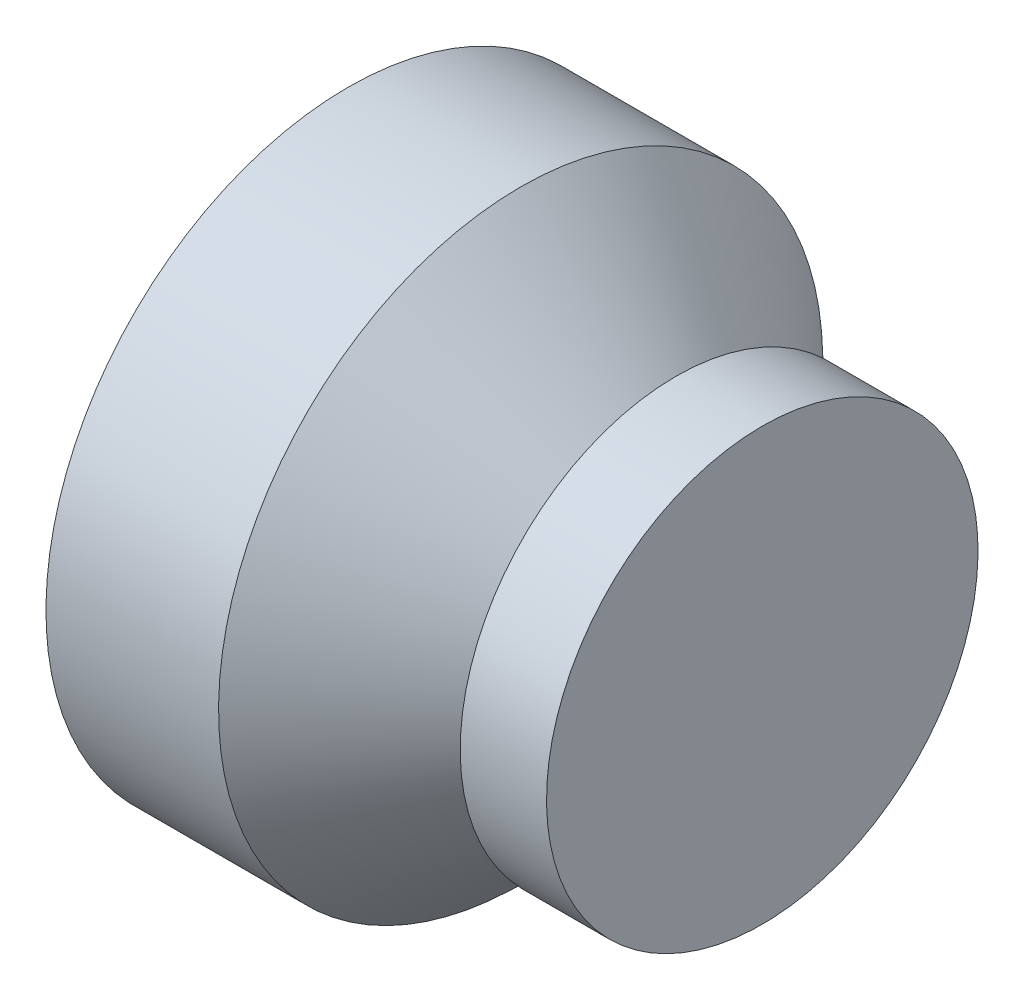
ISO-10303-21;
HEADER;
FILE_DESCRIPTION(('STEP AP214'),'2;1');
FILE_NAME('part.step','',(''),(''),'','','');
FILE_SCHEMA(('AUTOMOTIVE_DESIGN { 1 0 10303 214 1 1 1 1 }'));
ENDSEC;
DATA;
#1=APPLICATION_CONTEXT('core data for automotive mechanical design processes');
#2=APPLICATION_PROTOCOL_DEFINITION('international standard','automotive_design',2000,#1);
#3=PRODUCT_CONTEXT('',#1,'mechanical');
#4=PRODUCT('Part','Part','',(#3));
#5=PRODUCT_RELATED_PRODUCT_CATEGORY('part','',(#4));
#6=PRODUCT_DEFINITION_FORMATION('','',#4);
#7=PRODUCT_DEFINITION_CONTEXT('part definition',#1,'design');
#8=PRODUCT_DEFINITION('design','',#6,#7);
#9=PRODUCT_DEFINITION_SHAPE('','',#8);
#10=(LENGTH_UNIT() NAMED_UNIT(*) SI_UNIT(.MILLI.,.METRE.));
#11=(NAMED_UNIT(*) PLANE_ANGLE_UNIT() SI_UNIT($,.RADIAN.));
#12=(NAMED_UNIT(*) SI_UNIT($,.STERADIAN.) SOLID_ANGLE_UNIT());
#13=UNCERTAINTY_MEASURE_WITH_UNIT(LENGTH_MEASURE(1.E-05),#10,'distance_accuracy_value','');
#14=(GEOMETRIC_REPRESENTATION_CONTEXT(3) GLOBAL_UNCERTAINTY_ASSIGNED_CONTEXT((#13)) GLOBAL_UNIT_ASSIGNED_CONTEXT((#10,
#11,#12)) REPRESENTATION_CONTEXT('',''));
#15=CARTESIAN_POINT('',(0.,0.,0.));
#16=DIRECTION('',(0.,0.,1.));
#17=DIRECTION('',(1.,0.,0.));
#18=AXIS2_PLACEMENT_3D('',#15,#16,#17);
#19=CARTESIAN_POINT('',(-119.,12.5,0.));
#20=DIRECTION('',(-1.,0.,0.));
#21=DIRECTION('',(0.,-1.,0.));
#22=AXIS2_PLACEMENT_3D('',#19,#20,#21);
#23=PLANE('',#22);
#24=CARTESIAN_POINT('',(-119.,0.,0.));
#25=DIRECTION('',(1.,0.,0.));
#26=DIRECTION('',(0.,1.,0.));
#27=AXIS2_PLACEMENT_3D('',#24,#25,#26);
#28=CIRCLE('',#27,12.5);
#29=CARTESIAN_POINT('',(-119.,12.5,0.));
#30=VERTEX_POINT('',#29);
#31=EDGE_CURVE('E53',#30,#30,#28,.T.);
#32=ORIENTED_EDGE('',*,*,#31,.T.);
#33=EDGE_LOOP('',(#32));
#34=FACE_BOUND('',#33,.T.);
#35=ADVANCED_FACE('F34',(#34),#23,.F.);
#36=CARTESIAN_POINT('',(-143.,17.5,0.));
#37=DIRECTION('',(-1.,0.,0.));
#38=DIRECTION('',(0.,-1.,0.));
#39=AXIS2_PLACEMENT_3D('',#36,#37,#38);
#40=PLANE('',#39);
#41=CARTESIAN_POINT('',(-143.,0.,0.));
#42=DIRECTION('',(1.,0.,0.));
#43=DIRECTION('',(0.,1.,0.));
#44=AXIS2_PLACEMENT_3D('',#41,#42,#43);
#45=CIRCLE('',#44,17.5);
#46=CARTESIAN_POINT('',(-143.,17.5,0.));
#47=VERTEX_POINT('',#46);
#48=EDGE_CURVE('E10',#47,#47,#45,.T.);
#49=ORIENTED_EDGE('',*,*,#48,.F.);
#50=EDGE_LOOP('',(#49));
#51=FACE_BOUND('',#50,.T.);
#52=ADVANCED_FACE('F70',(#51),#40,.T.);
#53=CARTESIAN_POINT('',(-119.,0.,0.));
#54=DIRECTION('',(1.,0.,0.));
#55=DIRECTION('',(0.,1.,0.));
#56=AXIS2_PLACEMENT_3D('',#53,#54,#55);
#57=CYLINDRICAL_SURFACE('',#56,17.5);
#58=ORIENTED_EDGE('',*,*,#48,.T.);
#59=EDGE_LOOP('',(#58));
#60=FACE_BOUND('',#59,.T.);
#61=CARTESIAN_POINT('',(-133.,0.,0.));
#62=DIRECTION('',(1.,0.,0.));
#63=DIRECTION('',(0.,1.,0.));
#64=AXIS2_PLACEMENT_3D('',#61,#62,#63);
#65=CIRCLE('',#64,17.5);
#66=CARTESIAN_POINT('',(-133.,17.5,0.));
#67=VERTEX_POINT('',#66);
#68=EDGE_CURVE('E40',#67,#67,#65,.T.);
#69=ORIENTED_EDGE('',*,*,#68,.F.);
#70=EDGE_LOOP('',(#69));
#71=FACE_BOUND('',#70,.T.);
#72=ADVANCED_FACE('F74',(#60,#71),#57,.T.);
#73=CARTESIAN_POINT('',(-124.,0.,0.));
#74=DIRECTION('',(-1.,0.,0.));
#75=DIRECTION('',(0.,-1.,0.));
#76=AXIS2_PLACEMENT_3D('',#73,#74,#75);
#77=CONICAL_SURFACE('',#76,8.99999999999998,0.756834505558693);
#78=ORIENTED_EDGE('',*,*,#68,.T.);
#79=EDGE_LOOP('',(#78));
#80=FACE_BOUND('',#79,.T.);
#81=CARTESIAN_POINT('',(-124.,0.,0.));
#82=DIRECTION('',(1.,0.,0.));
#83=DIRECTION('',(0.,1.,0.));
#84=AXIS2_PLACEMENT_3D('',#81,#82,#83);
#85=CIRCLE('',#84,8.99999999999998);
#86=CARTESIAN_POINT('',(-124.,9.,0.));
#87=VERTEX_POINT('',#86);
#88=EDGE_CURVE('E44',#87,#87,#85,.T.);
#89=ORIENTED_EDGE('',*,*,#88,.F.);
#90=EDGE_LOOP('',(#89));
#91=FACE_BOUND('',#90,.T.);
#92=ADVANCED_FACE('F66',(#80,#91),#77,.T.);
#93=CARTESIAN_POINT('',(-124.,12.5,0.));
#94=DIRECTION('',(-1.,0.,0.));
#95=DIRECTION('',(0.,-1.,0.));
#96=AXIS2_PLACEMENT_3D('',#93,#94,#95);
#97=PLANE('',#96);
#98=ORIENTED_EDGE('',*,*,#88,.T.);
#99=EDGE_LOOP('',(#98));
#100=FACE_BOUND('',#99,.T.);
#101=CARTESIAN_POINT('',(-124.,0.,0.));
#102=DIRECTION('',(1.,0.,0.));
#103=DIRECTION('',(0.,1.,0.));
#104=AXIS2_PLACEMENT_3D('',#101,#102,#103);
#105=CIRCLE('',#104,12.5);
#106=CARTESIAN_POINT('',(-124.,12.5,0.));
#107=VERTEX_POINT('',#106);
#108=EDGE_CURVE('E48',#107,#107,#105,.T.);
#109=ORIENTED_EDGE('',*,*,#108,.F.);
#110=EDGE_LOOP('',(#109));
#111=FACE_BOUND('',#110,.T.);
#112=ADVANCED_FACE('F60',(#100,#111),#97,.T.);
#113=CARTESIAN_POINT('',(-119.,0.,0.));
#114=DIRECTION('',(1.,0.,0.));
#115=DIRECTION('',(0.,1.,0.));
#116=AXIS2_PLACEMENT_3D('',#113,#114,#115);
#117=CYLINDRICAL_SURFACE('',#116,12.5);
#118=ORIENTED_EDGE('',*,*,#108,.T.);
#119=EDGE_LOOP('',(#118));
#120=FACE_BOUND('',#119,.T.);
#121=ORIENTED_EDGE('',*,*,#31,.F.);
#122=EDGE_LOOP('',(#121));
#123=FACE_BOUND('',#122,.T.);
#124=ADVANCED_FACE('F58',(#120,#123),#117,.T.);
#125=CLOSED_SHELL('',(#35,#52,#72,#92,#112,#124));
#126=MANIFOLD_SOLID_BREP('B2',#125);
#127=ADVANCED_BREP_SHAPE_REPRESENTATION('',(#18,#126),#14);
#128=SHAPE_DEFINITION_REPRESENTATION(#9,#127);
ENDSEC;
END-ISO-10303-21;
